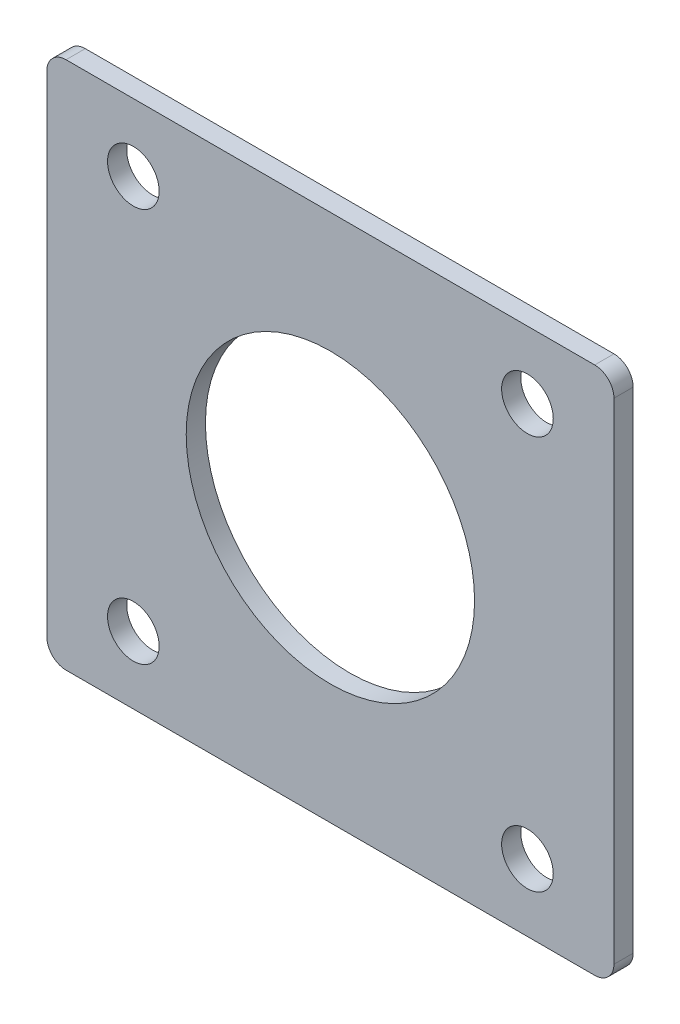
ISO-10303-21;
HEADER;
FILE_DESCRIPTION(('STEP AP214'),'2;1');
FILE_NAME('part.step','',(''),(''),'','','');
FILE_SCHEMA(('AUTOMOTIVE_DESIGN { 1 0 10303 214 1 1 1 1 }'));
ENDSEC;
DATA;
#1=APPLICATION_CONTEXT('core data for automotive mechanical design processes');
#2=APPLICATION_PROTOCOL_DEFINITION('international standard','automotive_design',2000,#1);
#3=PRODUCT_CONTEXT('',#1,'mechanical');
#4=PRODUCT('Part','Part','',(#3));
#5=PRODUCT_RELATED_PRODUCT_CATEGORY('part','',(#4));
#6=PRODUCT_DEFINITION_FORMATION('','',#4);
#7=PRODUCT_DEFINITION_CONTEXT('part definition',#1,'design');
#8=PRODUCT_DEFINITION('design','',#6,#7);
#9=PRODUCT_DEFINITION_SHAPE('','',#8);
#10=(LENGTH_UNIT() NAMED_UNIT(*) SI_UNIT(.MILLI.,.METRE.));
#11=(NAMED_UNIT(*) PLANE_ANGLE_UNIT() SI_UNIT($,.RADIAN.));
#12=(NAMED_UNIT(*) SI_UNIT($,.STERADIAN.) SOLID_ANGLE_UNIT());
#13=UNCERTAINTY_MEASURE_WITH_UNIT(LENGTH_MEASURE(1.E-05),#10,'distance_accuracy_value','');
#14=(GEOMETRIC_REPRESENTATION_CONTEXT(3) GLOBAL_UNCERTAINTY_ASSIGNED_CONTEXT((#13)) GLOBAL_UNIT_ASSIGNED_CONTEXT((#10,
#11,#12)) REPRESENTATION_CONTEXT('',''));
#15=CARTESIAN_POINT('',(0.,0.,0.));
#16=DIRECTION('',(0.,0.,1.));
#17=DIRECTION('',(1.,0.,0.));
#18=AXIS2_PLACEMENT_3D('',#15,#16,#17);
#19=CARTESIAN_POINT('',(-93.6625,-87.3125,6.35));
#20=DIRECTION('',(0.,0.,1.));
#21=DIRECTION('',(1.,0.,0.));
#22=AXIS2_PLACEMENT_3D('',#19,#20,#21);
#23=PLANE('',#22);
#24=CARTESIAN_POINT('',(-65.0875,-65.0875,6.35));
#25=DIRECTION('',(0.,0.,1.));
#26=DIRECTION('',(1.,0.,0.));
#27=AXIS2_PLACEMENT_3D('',#24,#25,#26);
#28=CIRCLE('',#27,8.53281250000001);
#29=CARTESIAN_POINT('',(-56.5546875,-65.0875,6.35));
#30=VERTEX_POINT('',#29);
#31=EDGE_CURVE('E190',#30,#30,#28,.T.);
#32=ORIENTED_EDGE('',*,*,#31,.F.);
#33=EDGE_LOOP('',(#32));
#34=FACE_BOUND('',#33,.T.);
#35=CARTESIAN_POINT('',(65.0874999999995,65.0875000000004,6.35));
#36=DIRECTION('',(0.,0.,1.));
#37=DIRECTION('',(1.,0.,0.));
#38=AXIS2_PLACEMENT_3D('',#35,#36,#37);
#39=CIRCLE('',#38,8.5328125);
#40=CARTESIAN_POINT('',(73.6203124999995,65.0875000000004,6.35));
#41=VERTEX_POINT('',#40);
#42=EDGE_CURVE('E178',#41,#41,#39,.T.);
#43=ORIENTED_EDGE('',*,*,#42,.F.);
#44=EDGE_LOOP('',(#43));
#45=FACE_BOUND('',#44,.T.);
#46=DIRECTION('',(0.,-1.,0.));
#47=VECTOR('',#46,1.);
#48=CARTESIAN_POINT('',(-93.6625,87.3125,6.35));
#49=LINE('',#48,#47);
#50=CARTESIAN_POINT('',(-93.6625,80.9625,6.35));
#51=VERTEX_POINT('',#50);
#52=CARTESIAN_POINT('',(-93.6625,-80.9625,6.35));
#53=VERTEX_POINT('',#52);
#54=EDGE_CURVE('E135',#51,#53,#49,.T.);
#55=ORIENTED_EDGE('',*,*,#54,.T.);
#56=CARTESIAN_POINT('',(-87.3125,-80.9625,6.35));
#57=DIRECTION('',(0.,0.,1.));
#58=DIRECTION('',(1.,0.,0.));
#59=AXIS2_PLACEMENT_3D('',#56,#57,#58);
#60=CIRCLE('',#59,6.35);
#61=CARTESIAN_POINT('',(-87.3125,-87.3125,6.35));
#62=VERTEX_POINT('',#61);
#63=EDGE_CURVE('E150',#53,#62,#60,.T.);
#64=ORIENTED_EDGE('',*,*,#63,.T.);
#65=DIRECTION('',(1.,0.,0.));
#66=VECTOR('',#65,1.);
#67=CARTESIAN_POINT('',(-93.6625,-87.3125,6.35));
#68=LINE('',#67,#66);
#69=CARTESIAN_POINT('',(87.3124999999999,-87.3125,6.35));
#70=VERTEX_POINT('',#69);
#71=EDGE_CURVE('E117',#62,#70,#68,.T.);
#72=ORIENTED_EDGE('',*,*,#71,.T.);
#73=CARTESIAN_POINT('',(87.3124999999999,-80.9625,6.35));
#74=DIRECTION('',(0.,0.,1.));
#75=DIRECTION('',(1.,0.,0.));
#76=AXIS2_PLACEMENT_3D('',#73,#74,#75);
#77=CIRCLE('',#76,6.35);
#78=CARTESIAN_POINT('',(93.6624999999999,-80.9625,6.35));
#79=VERTEX_POINT('',#78);
#80=EDGE_CURVE('E145',#70,#79,#77,.T.);
#81=ORIENTED_EDGE('',*,*,#80,.T.);
#82=DIRECTION('',(0.,1.,0.));
#83=VECTOR('',#82,1.);
#84=CARTESIAN_POINT('',(93.6624999999999,87.3125,6.35));
#85=LINE('',#84,#83);
#86=CARTESIAN_POINT('',(93.6624999999999,80.9625,6.35));
#87=VERTEX_POINT('',#86);
#88=EDGE_CURVE('E161',#79,#87,#85,.T.);
#89=ORIENTED_EDGE('',*,*,#88,.T.);
#90=CARTESIAN_POINT('',(87.3125,80.9625,6.35));
#91=DIRECTION('',(0.,0.,1.));
#92=DIRECTION('',(1.,0.,0.));
#93=AXIS2_PLACEMENT_3D('',#90,#91,#92);
#94=CIRCLE('',#93,6.35);
#95=CARTESIAN_POINT('',(87.3125,87.3125,6.35));
#96=VERTEX_POINT('',#95);
#97=EDGE_CURVE('E53',#87,#96,#94,.T.);
#98=ORIENTED_EDGE('',*,*,#97,.T.);
#99=DIRECTION('',(-1.,0.,0.));
#100=VECTOR('',#99,1.);
#101=CARTESIAN_POINT('',(-93.6625,87.3125,6.35));
#102=LINE('',#101,#100);
#103=CARTESIAN_POINT('',(-87.3125,87.3125,6.35));
#104=VERTEX_POINT('',#103);
#105=EDGE_CURVE('E136',#96,#104,#102,.T.);
#106=ORIENTED_EDGE('',*,*,#105,.T.);
#107=CARTESIAN_POINT('',(-87.3125,80.9625,6.35));
#108=DIRECTION('',(0.,0.,1.));
#109=DIRECTION('',(1.,0.,0.));
#110=AXIS2_PLACEMENT_3D('',#107,#108,#109);
#111=CIRCLE('',#110,6.35);
#112=EDGE_CURVE('E148',#104,#51,#111,.T.);
#113=ORIENTED_EDGE('',*,*,#112,.T.);
#114=EDGE_LOOP('',(#55,#64,#72,#81,#89,#98,#106,#113));
#115=FACE_BOUND('',#114,.T.);
#116=CARTESIAN_POINT('',(-65.0875000000007,65.0874999999993,6.35));
#117=DIRECTION('',(0.,0.,1.));
#118=DIRECTION('',(1.,0.,0.));
#119=AXIS2_PLACEMENT_3D('',#116,#117,#118);
#120=CIRCLE('',#119,8.53281250000001);
#121=CARTESIAN_POINT('',(-56.5546875000007,65.0874999999993,6.35));
#122=VERTEX_POINT('',#121);
#123=EDGE_CURVE('E130',#122,#122,#120,.T.);
#124=ORIENTED_EDGE('',*,*,#123,.F.);
#125=EDGE_LOOP('',(#124));
#126=FACE_BOUND('',#125,.T.);
#127=CARTESIAN_POINT('',(65.0875000000002,-65.0874999999998,6.35));
#128=DIRECTION('',(0.,0.,1.));
#129=DIRECTION('',(1.,0.,0.));
#130=AXIS2_PLACEMENT_3D('',#127,#128,#129);
#131=CIRCLE('',#130,8.5328125);
#132=CARTESIAN_POINT('',(73.6203125000002,-65.0874999999998,6.35));
#133=VERTEX_POINT('',#132);
#134=EDGE_CURVE('E184',#133,#133,#131,.T.);
#135=ORIENTED_EDGE('',*,*,#134,.F.);
#136=EDGE_LOOP('',(#135));
#137=FACE_BOUND('',#136,.T.);
#138=CARTESIAN_POINT('',(0.,0.,6.35));
#139=DIRECTION('',(0.,0.,1.));
#140=DIRECTION('',(1.,0.,0.));
#141=AXIS2_PLACEMENT_3D('',#138,#139,#140);
#142=CIRCLE('',#141,47.625);
#143=CARTESIAN_POINT('',(47.625,0.,6.35));
#144=VERTEX_POINT('',#143);
#145=EDGE_CURVE('E196',#144,#144,#142,.T.);
#146=ORIENTED_EDGE('',*,*,#145,.F.);
#147=EDGE_LOOP('',(#146));
#148=FACE_BOUND('',#147,.T.);
#149=ADVANCED_FACE('F31',(#34,#45,#115,#126,#137,#148),#23,.T.);
#150=CARTESIAN_POINT('',(-93.6625,-87.3125,0.));
#151=DIRECTION('',(0.,0.,1.));
#152=DIRECTION('',(1.,0.,0.));
#153=AXIS2_PLACEMENT_3D('',#150,#151,#152);
#154=PLANE('',#153);
#155=CARTESIAN_POINT('',(-65.0875,-65.0875,0.));
#156=DIRECTION('',(0.,0.,1.));
#157=DIRECTION('',(1.,0.,0.));
#158=AXIS2_PLACEMENT_3D('',#155,#156,#157);
#159=CIRCLE('',#158,8.53281250000001);
#160=CARTESIAN_POINT('',(-56.5546875,-65.0875,0.));
#161=VERTEX_POINT('',#160);
#162=EDGE_CURVE('E193',#161,#161,#159,.T.);
#163=ORIENTED_EDGE('',*,*,#162,.T.);
#164=EDGE_LOOP('',(#163));
#165=FACE_BOUND('',#164,.T.);
#166=CARTESIAN_POINT('',(65.0874999999995,65.0875000000004,0.));
#167=DIRECTION('',(0.,0.,1.));
#168=DIRECTION('',(1.,0.,0.));
#169=AXIS2_PLACEMENT_3D('',#166,#167,#168);
#170=CIRCLE('',#169,8.5328125);
#171=CARTESIAN_POINT('',(73.6203124999995,65.0875000000004,0.));
#172=VERTEX_POINT('',#171);
#173=EDGE_CURVE('E181',#172,#172,#170,.T.);
#174=ORIENTED_EDGE('',*,*,#173,.T.);
#175=EDGE_LOOP('',(#174));
#176=FACE_BOUND('',#175,.T.);
#177=DIRECTION('',(1.,0.,0.));
#178=VECTOR('',#177,1.);
#179=CARTESIAN_POINT('',(-93.6625,-87.3125,0.));
#180=LINE('',#179,#178);
#181=CARTESIAN_POINT('',(-87.3125,-87.3125,0.));
#182=VERTEX_POINT('',#181);
#183=CARTESIAN_POINT('',(87.3124999999999,-87.3125,0.));
#184=VERTEX_POINT('',#183);
#185=EDGE_CURVE('E114',#182,#184,#180,.T.);
#186=ORIENTED_EDGE('',*,*,#185,.F.);
#187=CARTESIAN_POINT('',(-87.3125,-80.9625,0.));
#188=DIRECTION('',(0.,0.,1.));
#189=DIRECTION('',(1.,0.,0.));
#190=AXIS2_PLACEMENT_3D('',#187,#188,#189);
#191=CIRCLE('',#190,6.35);
#192=CARTESIAN_POINT('',(-93.6625,-80.9625,0.));
#193=VERTEX_POINT('',#192);
#194=EDGE_CURVE('E97',#182,#193,#191,.F.);
#195=ORIENTED_EDGE('',*,*,#194,.T.);
#196=DIRECTION('',(0.,-1.,0.));
#197=VECTOR('',#196,1.);
#198=CARTESIAN_POINT('',(-93.6625,87.3125,0.));
#199=LINE('',#198,#197);
#200=CARTESIAN_POINT('',(-93.6625,80.9625,0.));
#201=VERTEX_POINT('',#200);
#202=EDGE_CURVE('E125',#201,#193,#199,.T.);
#203=ORIENTED_EDGE('',*,*,#202,.F.);
#204=CARTESIAN_POINT('',(-87.3125,80.9625,0.));
#205=DIRECTION('',(0.,0.,1.));
#206=DIRECTION('',(1.,0.,0.));
#207=AXIS2_PLACEMENT_3D('',#204,#205,#206);
#208=CIRCLE('',#207,6.35);
#209=CARTESIAN_POINT('',(-87.3125,87.3125,0.));
#210=VERTEX_POINT('',#209);
#211=EDGE_CURVE('E108',#201,#210,#208,.F.);
#212=ORIENTED_EDGE('',*,*,#211,.T.);
#213=DIRECTION('',(-1.,0.,0.));
#214=VECTOR('',#213,1.);
#215=CARTESIAN_POINT('',(-93.6625,87.3125,0.));
#216=LINE('',#215,#214);
#217=CARTESIAN_POINT('',(87.3125,87.3125,0.));
#218=VERTEX_POINT('',#217);
#219=EDGE_CURVE('E128',#218,#210,#216,.T.);
#220=ORIENTED_EDGE('',*,*,#219,.F.);
#221=CARTESIAN_POINT('',(87.3125,80.9625,0.));
#222=DIRECTION('',(0.,0.,1.));
#223=DIRECTION('',(1.,0.,0.));
#224=AXIS2_PLACEMENT_3D('',#221,#222,#223);
#225=CIRCLE('',#224,6.35);
#226=CARTESIAN_POINT('',(93.6624999999999,80.9625,0.));
#227=VERTEX_POINT('',#226);
#228=EDGE_CURVE('E139',#218,#227,#225,.F.);
#229=ORIENTED_EDGE('',*,*,#228,.T.);
#230=DIRECTION('',(0.,1.,0.));
#231=VECTOR('',#230,1.);
#232=CARTESIAN_POINT('',(93.6624999999999,87.3125,0.));
#233=LINE('',#232,#231);
#234=CARTESIAN_POINT('',(93.6624999999999,-80.9625,0.));
#235=VERTEX_POINT('',#234);
#236=EDGE_CURVE('E124',#235,#227,#233,.T.);
#237=ORIENTED_EDGE('',*,*,#236,.F.);
#238=CARTESIAN_POINT('',(87.3124999999999,-80.9625,0.));
#239=DIRECTION('',(0.,0.,1.));
#240=DIRECTION('',(1.,0.,0.));
#241=AXIS2_PLACEMENT_3D('',#238,#239,#240);
#242=CIRCLE('',#241,6.35);
#243=EDGE_CURVE('E118',#235,#184,#242,.F.);
#244=ORIENTED_EDGE('',*,*,#243,.T.);
#245=EDGE_LOOP('',(#186,#195,#203,#212,#220,#229,#237,#244));
#246=FACE_BOUND('',#245,.T.);
#247=CARTESIAN_POINT('',(-65.0875000000007,65.0874999999993,0.));
#248=DIRECTION('',(0.,0.,1.));
#249=DIRECTION('',(1.,0.,0.));
#250=AXIS2_PLACEMENT_3D('',#247,#248,#249);
#251=CIRCLE('',#250,8.53281250000001);
#252=CARTESIAN_POINT('',(-56.5546875000007,65.0874999999993,0.));
#253=VERTEX_POINT('',#252);
#254=EDGE_CURVE('E175',#253,#253,#251,.T.);
#255=ORIENTED_EDGE('',*,*,#254,.T.);
#256=EDGE_LOOP('',(#255));
#257=FACE_BOUND('',#256,.T.);
#258=CARTESIAN_POINT('',(65.0875000000002,-65.0874999999998,0.));
#259=DIRECTION('',(0.,0.,1.));
#260=DIRECTION('',(1.,0.,0.));
#261=AXIS2_PLACEMENT_3D('',#258,#259,#260);
#262=CIRCLE('',#261,8.5328125);
#263=CARTESIAN_POINT('',(73.6203125000002,-65.0874999999998,0.));
#264=VERTEX_POINT('',#263);
#265=EDGE_CURVE('E187',#264,#264,#262,.T.);
#266=ORIENTED_EDGE('',*,*,#265,.T.);
#267=EDGE_LOOP('',(#266));
#268=FACE_BOUND('',#267,.T.);
#269=CARTESIAN_POINT('',(0.,0.,0.));
#270=DIRECTION('',(0.,0.,1.));
#271=DIRECTION('',(1.,0.,0.));
#272=AXIS2_PLACEMENT_3D('',#269,#270,#271);
#273=CIRCLE('',#272,47.625);
#274=CARTESIAN_POINT('',(47.625,0.,0.));
#275=VERTEX_POINT('',#274);
#276=EDGE_CURVE('E199',#275,#275,#273,.T.);
#277=ORIENTED_EDGE('',*,*,#276,.T.);
#278=EDGE_LOOP('',(#277));
#279=FACE_BOUND('',#278,.T.);
#280=ADVANCED_FACE('F121',(#165,#176,#246,#257,#268,#279),#154,.F.);
#281=CARTESIAN_POINT('',(-93.6625,87.3125,6.35));
#282=DIRECTION('',(1.,0.,0.));
#283=DIRECTION('',(0.,1.,0.));
#284=AXIS2_PLACEMENT_3D('',#281,#282,#283);
#285=PLANE('',#284);
#286=ORIENTED_EDGE('',*,*,#202,.T.);
#287=DIRECTION('',(0.,0.,-1.));
#288=VECTOR('',#287,1.);
#289=CARTESIAN_POINT('',(-93.6625,-80.9625,6.35));
#290=LINE('',#289,#288);
#291=EDGE_CURVE('E102',#193,#53,#290,.F.);
#292=ORIENTED_EDGE('',*,*,#291,.T.);
#293=ORIENTED_EDGE('',*,*,#54,.F.);
#294=DIRECTION('',(0.,0.,-1.));
#295=VECTOR('',#294,1.);
#296=CARTESIAN_POINT('',(-93.6625,80.9625,6.35));
#297=LINE('',#296,#295);
#298=EDGE_CURVE('E107',#51,#201,#297,.T.);
#299=ORIENTED_EDGE('',*,*,#298,.T.);
#300=EDGE_LOOP('',(#286,#292,#293,#299));
#301=FACE_BOUND('',#300,.T.);
#302=ADVANCED_FACE('F214',(#301),#285,.F.);
#303=CARTESIAN_POINT('',(-93.6625,-87.3125,6.35));
#304=DIRECTION('',(0.,1.,0.));
#305=DIRECTION('',(0.,0.,1.));
#306=AXIS2_PLACEMENT_3D('',#303,#304,#305);
#307=PLANE('',#306);
#308=ORIENTED_EDGE('',*,*,#71,.F.);
#309=DIRECTION('',(0.,0.,-1.));
#310=VECTOR('',#309,1.);
#311=CARTESIAN_POINT('',(-87.3125,-87.3125,6.35));
#312=LINE('',#311,#310);
#313=EDGE_CURVE('E101',#62,#182,#312,.T.);
#314=ORIENTED_EDGE('',*,*,#313,.T.);
#315=ORIENTED_EDGE('',*,*,#185,.T.);
#316=DIRECTION('',(0.,0.,-1.));
#317=VECTOR('',#316,1.);
#318=CARTESIAN_POINT('',(87.3124999999999,-87.3125,6.35));
#319=LINE('',#318,#317);
#320=EDGE_CURVE('E119',#184,#70,#319,.F.);
#321=ORIENTED_EDGE('',*,*,#320,.T.);
#322=EDGE_LOOP('',(#308,#314,#315,#321));
#323=FACE_BOUND('',#322,.T.);
#324=ADVANCED_FACE('F113',(#323),#307,.F.);
#325=CARTESIAN_POINT('',(93.6624999999999,87.3125,6.35));
#326=DIRECTION('',(-1.,0.,0.));
#327=DIRECTION('',(0.,0.,1.));
#328=AXIS2_PLACEMENT_3D('',#325,#326,#327);
#329=PLANE('',#328);
#330=ORIENTED_EDGE('',*,*,#236,.T.);
#331=DIRECTION('',(0.,0.,-1.));
#332=VECTOR('',#331,1.);
#333=CARTESIAN_POINT('',(93.6624999999999,80.9625,6.35));
#334=LINE('',#333,#332);
#335=EDGE_CURVE('E11',#227,#87,#334,.F.);
#336=ORIENTED_EDGE('',*,*,#335,.T.);
#337=ORIENTED_EDGE('',*,*,#88,.F.);
#338=DIRECTION('',(0.,0.,-1.));
#339=VECTOR('',#338,1.);
#340=CARTESIAN_POINT('',(93.6624999999999,-80.9625,6.35));
#341=LINE('',#340,#339);
#342=EDGE_CURVE('E39',#79,#235,#341,.T.);
#343=ORIENTED_EDGE('',*,*,#342,.T.);
#344=EDGE_LOOP('',(#330,#336,#337,#343));
#345=FACE_BOUND('',#344,.T.);
#346=ADVANCED_FACE('F159',(#345),#329,.F.);
#347=CARTESIAN_POINT('',(-93.6625,87.3125,6.35));
#348=DIRECTION('',(0.,-1.,0.));
#349=DIRECTION('',(0.,0.,-1.));
#350=AXIS2_PLACEMENT_3D('',#347,#348,#349);
#351=PLANE('',#350);
#352=ORIENTED_EDGE('',*,*,#219,.T.);
#353=DIRECTION('',(0.,0.,-1.));
#354=VECTOR('',#353,1.);
#355=CARTESIAN_POINT('',(-87.3125,87.3125,6.35));
#356=LINE('',#355,#354);
#357=EDGE_CURVE('E46',#210,#104,#356,.F.);
#358=ORIENTED_EDGE('',*,*,#357,.T.);
#359=ORIENTED_EDGE('',*,*,#105,.F.);
#360=DIRECTION('',(0.,0.,-1.));
#361=VECTOR('',#360,1.);
#362=CARTESIAN_POINT('',(87.3125,87.3125,6.35));
#363=LINE('',#362,#361);
#364=EDGE_CURVE('E152',#96,#218,#363,.T.);
#365=ORIENTED_EDGE('',*,*,#364,.T.);
#366=EDGE_LOOP('',(#352,#358,#359,#365));
#367=FACE_BOUND('',#366,.T.);
#368=ADVANCED_FACE('F168',(#367),#351,.F.);
#369=CARTESIAN_POINT('',(-65.0875000000007,65.0874999999993,6.35));
#370=DIRECTION('',(0.,0.,-1.));
#371=DIRECTION('',(-1.,0.,0.));
#372=AXIS2_PLACEMENT_3D('',#369,#370,#371);
#373=CYLINDRICAL_SURFACE('',#372,8.53281250000001);
#374=ORIENTED_EDGE('',*,*,#123,.T.);
#375=EDGE_LOOP('',(#374));
#376=FACE_BOUND('',#375,.T.);
#377=ORIENTED_EDGE('',*,*,#254,.F.);
#378=EDGE_LOOP('',(#377));
#379=FACE_BOUND('',#378,.T.);
#380=ADVANCED_FACE('F220',(#376,#379),#373,.F.);
#381=CARTESIAN_POINT('',(65.0874999999995,65.0875000000004,6.35));
#382=DIRECTION('',(0.,0.,-1.));
#383=DIRECTION('',(-1.,0.,0.));
#384=AXIS2_PLACEMENT_3D('',#381,#382,#383);
#385=CYLINDRICAL_SURFACE('',#384,8.5328125);
#386=ORIENTED_EDGE('',*,*,#42,.T.);
#387=EDGE_LOOP('',(#386));
#388=FACE_BOUND('',#387,.T.);
#389=ORIENTED_EDGE('',*,*,#173,.F.);
#390=EDGE_LOOP('',(#389));
#391=FACE_BOUND('',#390,.T.);
#392=ADVANCED_FACE('F254',(#388,#391),#385,.F.);
#393=CARTESIAN_POINT('',(65.0875000000002,-65.0874999999998,6.35));
#394=DIRECTION('',(0.,0.,-1.));
#395=DIRECTION('',(-1.,0.,0.));
#396=AXIS2_PLACEMENT_3D('',#393,#394,#395);
#397=CYLINDRICAL_SURFACE('',#396,8.5328125);
#398=ORIENTED_EDGE('',*,*,#134,.T.);
#399=EDGE_LOOP('',(#398));
#400=FACE_BOUND('',#399,.T.);
#401=ORIENTED_EDGE('',*,*,#265,.F.);
#402=EDGE_LOOP('',(#401));
#403=FACE_BOUND('',#402,.T.);
#404=ADVANCED_FACE('F250',(#400,#403),#397,.F.);
#405=CARTESIAN_POINT('',(-65.0875,-65.0875,6.35));
#406=DIRECTION('',(0.,0.,-1.));
#407=DIRECTION('',(-1.,0.,0.));
#408=AXIS2_PLACEMENT_3D('',#405,#406,#407);
#409=CYLINDRICAL_SURFACE('',#408,8.53281250000001);
#410=ORIENTED_EDGE('',*,*,#31,.T.);
#411=EDGE_LOOP('',(#410));
#412=FACE_BOUND('',#411,.T.);
#413=ORIENTED_EDGE('',*,*,#162,.F.);
#414=EDGE_LOOP('',(#413));
#415=FACE_BOUND('',#414,.T.);
#416=ADVANCED_FACE('F253',(#412,#415),#409,.F.);
#417=CARTESIAN_POINT('',(0.,0.,6.35));
#418=DIRECTION('',(0.,0.,-1.));
#419=DIRECTION('',(-1.,0.,0.));
#420=AXIS2_PLACEMENT_3D('',#417,#418,#419);
#421=CYLINDRICAL_SURFACE('',#420,47.625);
#422=ORIENTED_EDGE('',*,*,#145,.T.);
#423=EDGE_LOOP('',(#422));
#424=FACE_BOUND('',#423,.T.);
#425=ORIENTED_EDGE('',*,*,#276,.F.);
#426=EDGE_LOOP('',(#425));
#427=FACE_BOUND('',#426,.T.);
#428=ADVANCED_FACE('F205',(#424,#427),#421,.F.);
#429=CARTESIAN_POINT('',(-87.3125,-80.9625,6.35));
#430=DIRECTION('',(0.,0.,-1.));
#431=DIRECTION('',(-1.,0.,0.));
#432=AXIS2_PLACEMENT_3D('',#429,#430,#431);
#433=CYLINDRICAL_SURFACE('',#432,6.35);
#434=ORIENTED_EDGE('',*,*,#63,.F.);
#435=ORIENTED_EDGE('',*,*,#291,.F.);
#436=ORIENTED_EDGE('',*,*,#194,.F.);
#437=ORIENTED_EDGE('',*,*,#313,.F.);
#438=EDGE_LOOP('',(#434,#435,#436,#437));
#439=FACE_BOUND('',#438,.T.);
#440=ADVANCED_FACE('F100',(#439),#433,.T.);
#441=CARTESIAN_POINT('',(-87.3125,80.9625,6.35));
#442=DIRECTION('',(0.,0.,-1.));
#443=DIRECTION('',(-1.,0.,0.));
#444=AXIS2_PLACEMENT_3D('',#441,#442,#443);
#445=CYLINDRICAL_SURFACE('',#444,6.35);
#446=ORIENTED_EDGE('',*,*,#112,.F.);
#447=ORIENTED_EDGE('',*,*,#357,.F.);
#448=ORIENTED_EDGE('',*,*,#211,.F.);
#449=ORIENTED_EDGE('',*,*,#298,.F.);
#450=EDGE_LOOP('',(#446,#447,#448,#449));
#451=FACE_BOUND('',#450,.T.);
#452=ADVANCED_FACE('F234',(#451),#445,.T.);
#453=CARTESIAN_POINT('',(87.3125,80.9625,6.35));
#454=DIRECTION('',(0.,0.,-1.));
#455=DIRECTION('',(-1.,0.,0.));
#456=AXIS2_PLACEMENT_3D('',#453,#454,#455);
#457=CYLINDRICAL_SURFACE('',#456,6.35);
#458=ORIENTED_EDGE('',*,*,#97,.F.);
#459=ORIENTED_EDGE('',*,*,#335,.F.);
#460=ORIENTED_EDGE('',*,*,#228,.F.);
#461=ORIENTED_EDGE('',*,*,#364,.F.);
#462=EDGE_LOOP('',(#458,#459,#460,#461));
#463=FACE_BOUND('',#462,.T.);
#464=ADVANCED_FACE('F167',(#463),#457,.T.);
#465=CARTESIAN_POINT('',(87.3124999999999,-80.9625,6.35));
#466=DIRECTION('',(0.,0.,-1.));
#467=DIRECTION('',(-1.,0.,0.));
#468=AXIS2_PLACEMENT_3D('',#465,#466,#467);
#469=CYLINDRICAL_SURFACE('',#468,6.35);
#470=ORIENTED_EDGE('',*,*,#80,.F.);
#471=ORIENTED_EDGE('',*,*,#320,.F.);
#472=ORIENTED_EDGE('',*,*,#243,.F.);
#473=ORIENTED_EDGE('',*,*,#342,.F.);
#474=EDGE_LOOP('',(#470,#471,#472,#473));
#475=FACE_BOUND('',#474,.T.);
#476=ADVANCED_FACE('F33',(#475),#469,.T.);
#477=CLOSED_SHELL('',(#149,#280,#302,#324,#346,#368,#380,#392,#404,#416,#428,#440,#452,#464,#476));
#478=MANIFOLD_SOLID_BREP('B2',#477);
#479=ADVANCED_BREP_SHAPE_REPRESENTATION('',(#18,#478),#14);
#480=SHAPE_DEFINITION_REPRESENTATION(#9,#479);
ENDSEC;
END-ISO-10303-21;
